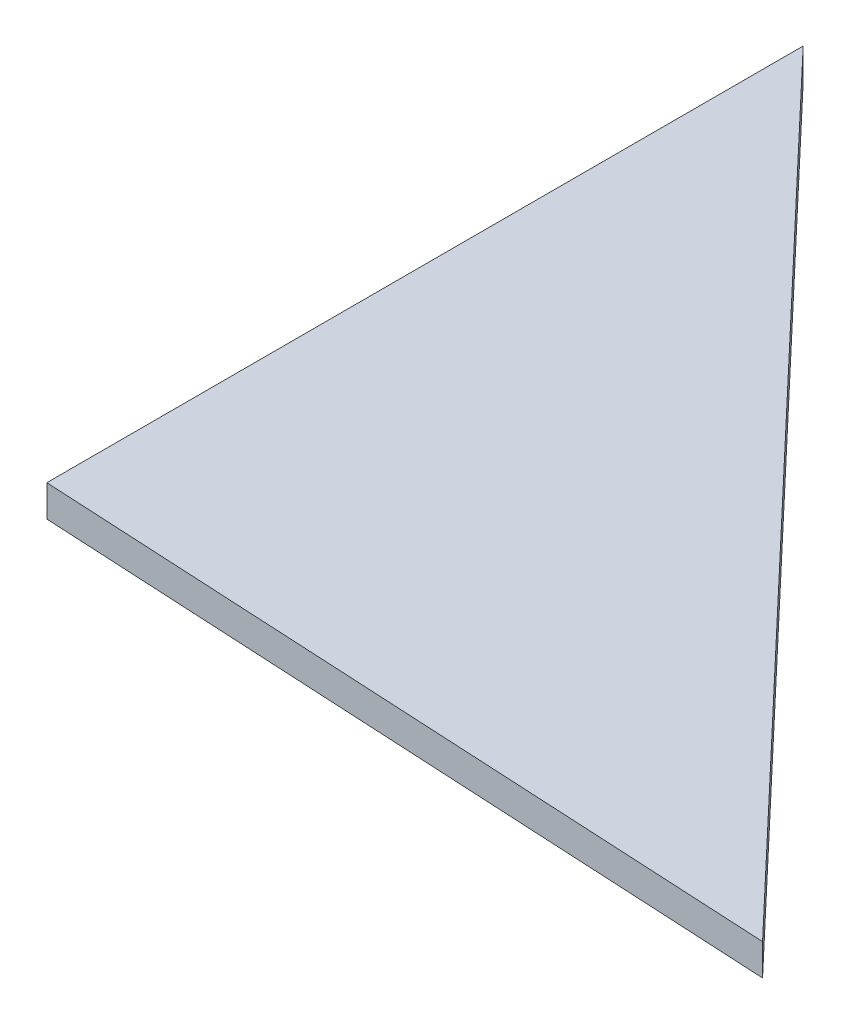
ISO-10303-21;
HEADER;
FILE_DESCRIPTION(('STEP AP214'),'2;1');
FILE_NAME('part.step','',(''),(''),'','','');
FILE_SCHEMA(('AUTOMOTIVE_DESIGN { 1 0 10303 214 1 1 1 1 }'));
ENDSEC;
DATA;
#1=APPLICATION_CONTEXT('core data for automotive mechanical design processes');
#2=APPLICATION_PROTOCOL_DEFINITION('international standard','automotive_design',2000,#1);
#3=PRODUCT_CONTEXT('',#1,'mechanical');
#4=PRODUCT('Part','Part','',(#3));
#5=PRODUCT_RELATED_PRODUCT_CATEGORY('part','',(#4));
#6=PRODUCT_DEFINITION_FORMATION('','',#4);
#7=PRODUCT_DEFINITION_CONTEXT('part definition',#1,'design');
#8=PRODUCT_DEFINITION('design','',#6,#7);
#9=PRODUCT_DEFINITION_SHAPE('','',#8);
#10=(LENGTH_UNIT() NAMED_UNIT(*) SI_UNIT(.MILLI.,.METRE.));
#11=(NAMED_UNIT(*) PLANE_ANGLE_UNIT() SI_UNIT($,.RADIAN.));
#12=(NAMED_UNIT(*) SI_UNIT($,.STERADIAN.) SOLID_ANGLE_UNIT());
#13=UNCERTAINTY_MEASURE_WITH_UNIT(LENGTH_MEASURE(1.E-05),#10,'distance_accuracy_value','');
#14=(GEOMETRIC_REPRESENTATION_CONTEXT(3) GLOBAL_UNCERTAINTY_ASSIGNED_CONTEXT((#13)) GLOBAL_UNIT_ASSIGNED_CONTEXT((#10,
#11,#12)) REPRESENTATION_CONTEXT('',''));
#15=CARTESIAN_POINT('',(0.,0.,0.));
#16=DIRECTION('',(0.,0.,1.));
#17=DIRECTION('',(1.,0.,0.));
#18=AXIS2_PLACEMENT_3D('',#15,#16,#17);
#19=CARTESIAN_POINT('',(-8.10651441070629,1.5875,0.));
#20=DIRECTION('',(-1.,0.,0.));
#21=DIRECTION('',(0.,0.,1.));
#22=AXIS2_PLACEMENT_3D('',#19,#20,#21);
#23=PLANE('',#22);
#24=DIRECTION('',(0.,0.,-1.));
#25=VECTOR('',#24,1.);
#26=CARTESIAN_POINT('',(-8.10651441070629,0.,0.));
#27=LINE('',#26,#25);
#28=CARTESIAN_POINT('',(-8.10651441070629,0.,4.53859900544066));
#29=VERTEX_POINT('',#28);
#30=CARTESIAN_POINT('',(-8.1065144107063,0.,-33.5614009945593));
#31=VERTEX_POINT('',#30);
#32=EDGE_CURVE('E78',#29,#31,#27,.T.);
#33=ORIENTED_EDGE('',*,*,#32,.F.);
#34=DIRECTION('',(0.,-1.,0.));
#35=VECTOR('',#34,1.);
#36=CARTESIAN_POINT('',(-8.10651441070629,1.5875,4.53859900544066));
#37=LINE('',#36,#35);
#38=CARTESIAN_POINT('',(-8.10651441070629,1.5875,4.53859900544066));
#39=VERTEX_POINT('',#38);
#40=EDGE_CURVE('E11',#39,#29,#37,.T.);
#41=ORIENTED_EDGE('',*,*,#40,.F.);
#42=DIRECTION('',(0.,0.,-1.));
#43=VECTOR('',#42,1.);
#44=CARTESIAN_POINT('',(-8.10651441070629,1.5875,0.));
#45=LINE('',#44,#43);
#46=CARTESIAN_POINT('',(-8.1065144107063,1.5875,-33.5614009945593));
#47=VERTEX_POINT('',#46);
#48=EDGE_CURVE('E76',#39,#47,#45,.T.);
#49=ORIENTED_EDGE('',*,*,#48,.T.);
#50=DIRECTION('',(0.,-1.,0.));
#51=VECTOR('',#50,1.);
#52=CARTESIAN_POINT('',(-8.1065144107063,1.5875,-33.5614009945593));
#53=LINE('',#52,#51);
#54=EDGE_CURVE('E58',#47,#31,#53,.T.);
#55=ORIENTED_EDGE('',*,*,#54,.T.);
#56=EDGE_LOOP('',(#33,#41,#49,#55));
#57=FACE_BOUND('',#56,.T.);
#58=ADVANCED_FACE('F41',(#57),#23,.T.);
#59=CARTESIAN_POINT('',(-0.25941055678365,1.5875,4.94984829222817));
#60=DIRECTION('',(0.0523359562429474,0.,-0.998629534754574));
#61=DIRECTION('',(-0.998629534754574,0.,-0.0523359562429474));
#62=AXIS2_PLACEMENT_3D('',#59,#60,#61);
#63=PLANE('',#62);
#64=DIRECTION('',(0.998629534754574,0.,0.0523359562429474));
#65=VECTOR('',#64,1.);
#66=CARTESIAN_POINT('',(-0.25941055678365,0.,4.94984829222817));
#67=LINE('',#66,#65);
#68=CARTESIAN_POINT('',(29.941270863443,0.,6.53259893829695));
#69=VERTEX_POINT('',#68);
#70=EDGE_CURVE('E93',#29,#69,#67,.T.);
#71=ORIENTED_EDGE('',*,*,#70,.T.);
#72=DIRECTION('',(0.,-1.,0.));
#73=VECTOR('',#72,1.);
#74=CARTESIAN_POINT('',(29.941270863443,1.5875,6.53259893829695));
#75=LINE('',#74,#73);
#76=CARTESIAN_POINT('',(29.941270863443,1.5875,6.53259893829695));
#77=VERTEX_POINT('',#76);
#78=EDGE_CURVE('E50',#77,#69,#75,.T.);
#79=ORIENTED_EDGE('',*,*,#78,.F.);
#80=DIRECTION('',(0.998629534754574,0.,0.0523359562429474));
#81=VECTOR('',#80,1.);
#82=CARTESIAN_POINT('',(-0.25941055678365,1.5875,4.94984829222817));
#83=LINE('',#82,#81);
#84=EDGE_CURVE('E81',#39,#77,#83,.T.);
#85=ORIENTED_EDGE('',*,*,#84,.F.);
#86=ORIENTED_EDGE('',*,*,#40,.T.);
#87=EDGE_LOOP('',(#71,#79,#85,#86));
#88=FACE_BOUND('',#87,.T.);
#89=ADVANCED_FACE('F82',(#88),#63,.F.);
#90=CARTESIAN_POINT('',(12.4923148333603,1.5875,-11.8547641331056));
#91=DIRECTION('',(0.725374371012289,0.,-0.688354575693753));
#92=DIRECTION('',(-0.688354575693753,0.,-0.725374371012289));
#93=AXIS2_PLACEMENT_3D('',#90,#91,#92);
#94=PLANE('',#93);
#95=DIRECTION('',(0.688354575693753,0.,0.725374371012289));
#96=VECTOR('',#95,1.);
#97=CARTESIAN_POINT('',(12.4923148333603,0.,-11.8547641331056));
#98=LINE('',#97,#96);
#99=EDGE_CURVE('E89',#31,#69,#98,.T.);
#100=ORIENTED_EDGE('',*,*,#99,.F.);
#101=ORIENTED_EDGE('',*,*,#54,.F.);
#102=DIRECTION('',(0.688354575693753,0.,0.725374371012289));
#103=VECTOR('',#102,1.);
#104=CARTESIAN_POINT('',(12.4923148333603,1.5875,-11.8547641331056));
#105=LINE('',#104,#103);
#106=EDGE_CURVE('E85',#47,#77,#105,.T.);
#107=ORIENTED_EDGE('',*,*,#106,.T.);
#108=ORIENTED_EDGE('',*,*,#78,.T.);
#109=EDGE_LOOP('',(#100,#101,#107,#108));
#110=FACE_BOUND('',#109,.T.);
#111=ADVANCED_FACE('F106',(#110),#94,.T.);
#112=CARTESIAN_POINT('',(0.,1.5875,0.));
#113=DIRECTION('',(0.,1.,0.));
#114=DIRECTION('',(0.,0.,1.));
#115=AXIS2_PLACEMENT_3D('',#112,#113,#114);
#116=PLANE('',#115);
#117=ORIENTED_EDGE('',*,*,#48,.F.);
#118=ORIENTED_EDGE('',*,*,#84,.T.);
#119=ORIENTED_EDGE('',*,*,#106,.F.);
#120=EDGE_LOOP('',(#117,#118,#119));
#121=FACE_BOUND('',#120,.T.);
#122=ADVANCED_FACE('F87',(#121),#116,.T.);
#123=CARTESIAN_POINT('',(0.,0.,0.));
#124=DIRECTION('',(0.,1.,0.));
#125=DIRECTION('',(0.,0.,1.));
#126=AXIS2_PLACEMENT_3D('',#123,#124,#125);
#127=PLANE('',#126);
#128=ORIENTED_EDGE('',*,*,#32,.T.);
#129=ORIENTED_EDGE('',*,*,#99,.T.);
#130=ORIENTED_EDGE('',*,*,#70,.F.);
#131=EDGE_LOOP('',(#128,#129,#130));
#132=FACE_BOUND('',#131,.T.);
#133=ADVANCED_FACE('F105',(#132),#127,.F.);
#134=CLOSED_SHELL('',(#58,#89,#111,#122,#133));
#135=MANIFOLD_SOLID_BREP('B2',#134);
#136=ADVANCED_BREP_SHAPE_REPRESENTATION('',(#18,#135),#14);
#137=SHAPE_DEFINITION_REPRESENTATION(#9,#136);
ENDSEC;
END-ISO-10303-21;
